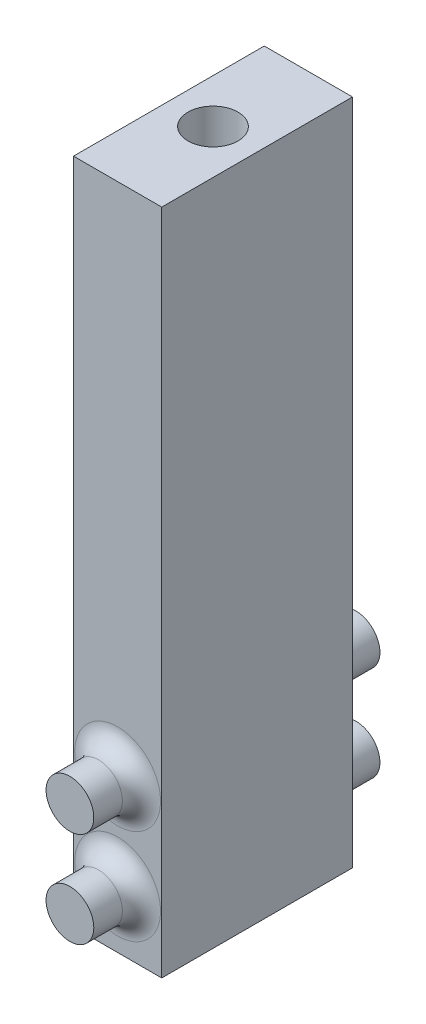
ISO-10303-21;
HEADER;
FILE_DESCRIPTION(('STEP AP214'),'2;1');
FILE_NAME('part.step','',(''),(''),'','','');
FILE_SCHEMA(('AUTOMOTIVE_DESIGN { 1 0 10303 214 1 1 1 1 }'));
ENDSEC;
DATA;
#1=APPLICATION_CONTEXT('core data for automotive mechanical design processes');
#2=APPLICATION_PROTOCOL_DEFINITION('international standard','automotive_design',2000,#1);
#3=PRODUCT_CONTEXT('',#1,'mechanical');
#4=PRODUCT('Part','Part','',(#3));
#5=PRODUCT_RELATED_PRODUCT_CATEGORY('part','',(#4));
#6=PRODUCT_DEFINITION_FORMATION('','',#4);
#7=PRODUCT_DEFINITION_CONTEXT('part definition',#1,'design');
#8=PRODUCT_DEFINITION('design','',#6,#7);
#9=PRODUCT_DEFINITION_SHAPE('','',#8);
#10=(LENGTH_UNIT() NAMED_UNIT(*) SI_UNIT(.MILLI.,.METRE.));
#11=(NAMED_UNIT(*) PLANE_ANGLE_UNIT() SI_UNIT($,.RADIAN.));
#12=(NAMED_UNIT(*) SI_UNIT($,.STERADIAN.) SOLID_ANGLE_UNIT());
#13=UNCERTAINTY_MEASURE_WITH_UNIT(LENGTH_MEASURE(1.E-05),#10,'distance_accuracy_value','');
#14=(GEOMETRIC_REPRESENTATION_CONTEXT(3) GLOBAL_UNCERTAINTY_ASSIGNED_CONTEXT((#13)) GLOBAL_UNIT_ASSIGNED_CONTEXT((#10,
#11,#12)) REPRESENTATION_CONTEXT('',''));
#15=CARTESIAN_POINT('',(0.,0.,0.));
#16=DIRECTION('',(0.,0.,1.));
#17=DIRECTION('',(1.,0.,0.));
#18=AXIS2_PLACEMENT_3D('',#15,#16,#17);
#19=CARTESIAN_POINT('',(20.9221246361529,20.,38.3604722689117));
#20=DIRECTION('',(0.,-1.,0.));
#21=DIRECTION('',(0.,0.,-1.));
#22=AXIS2_PLACEMENT_3D('',#19,#20,#21);
#23=CYLINDRICAL_SURFACE('',#22,5.5);
#24=DIRECTION('',(0.,-1.,0.));
#25=VECTOR('',#24,1.);
#26=CARTESIAN_POINT('',(25.940839611124,20.,40.6104722689117));
#27=LINE('',#26,#25);
#28=CARTESIAN_POINT('',(25.940839611124,16.,40.6104722689117));
#29=VERTEX_POINT('',#28);
#30=CARTESIAN_POINT('',(25.940839611124,20.,40.6104722689117));
#31=VERTEX_POINT('',#30);
#32=EDGE_CURVE('E145',#29,#31,#27,.F.);
#33=ORIENTED_EDGE('',*,*,#32,.F.);
#34=CARTESIAN_POINT('',(20.9221246361529,16.,38.3604722689117));
#35=DIRECTION('',(0.,1.,0.));
#36=DIRECTION('',(0.,0.,1.));
#37=AXIS2_PLACEMENT_3D('',#34,#35,#36);
#38=CIRCLE('',#37,5.5);
#39=CARTESIAN_POINT('',(25.940839611124,16.,36.1104722689117));
#40=VERTEX_POINT('',#39);
#41=EDGE_CURVE('E257',#40,#29,#38,.F.);
#42=ORIENTED_EDGE('',*,*,#41,.F.);
#43=DIRECTION('',(0.,-1.,0.));
#44=VECTOR('',#43,1.);
#45=CARTESIAN_POINT('',(25.940839611124,20.,36.1104722689117));
#46=LINE('',#45,#44);
#47=CARTESIAN_POINT('',(25.940839611124,20.,36.1104722689117));
#48=VERTEX_POINT('',#47);
#49=EDGE_CURVE('E259',#48,#40,#46,.T.);
#50=ORIENTED_EDGE('',*,*,#49,.F.);
#51=CARTESIAN_POINT('',(20.9221246361529,20.,38.3604722689117));
#52=DIRECTION('',(0.,-1.,0.));
#53=DIRECTION('',(0.,0.,-1.));
#54=AXIS2_PLACEMENT_3D('',#51,#52,#53);
#55=CIRCLE('',#54,5.5);
#56=CARTESIAN_POINT('',(25.8211041217192,20.,35.8604722689117));
#57=VERTEX_POINT('',#56);
#58=EDGE_CURVE('E207',#57,#48,#55,.T.);
#59=ORIENTED_EDGE('',*,*,#58,.F.);
#60=CARTESIAN_POINT('',(23.6721246361528,20.,33.5973325480973));
#61=VERTEX_POINT('',#60);
#62=EDGE_CURVE('E203',#61,#57,#55,.T.);
#63=ORIENTED_EDGE('',*,*,#62,.F.);
#64=DIRECTION('',(0.,-1.,0.));
#65=VECTOR('',#64,1.);
#66=CARTESIAN_POINT('',(23.6721246361528,20.,33.5973325480973));
#67=LINE('',#66,#65);
#68=CARTESIAN_POINT('',(23.6721246361528,0.,33.5973325480973));
#69=VERTEX_POINT('',#68);
#70=EDGE_CURVE('E206',#69,#61,#67,.F.);
#71=ORIENTED_EDGE('',*,*,#70,.F.);
#72=CARTESIAN_POINT('',(20.9221246361529,0.,38.3604722689117));
#73=DIRECTION('',(0.,-1.,0.));
#74=DIRECTION('',(0.,0.,-1.));
#75=AXIS2_PLACEMENT_3D('',#72,#73,#74);
#76=CIRCLE('',#75,5.5);
#77=CARTESIAN_POINT('',(23.6721246361528,0.,43.1236119897261));
#78=VERTEX_POINT('',#77);
#79=EDGE_CURVE('E196',#69,#78,#76,.T.);
#80=ORIENTED_EDGE('',*,*,#79,.T.);
#81=DIRECTION('',(0.,-1.,0.));
#82=VECTOR('',#81,1.);
#83=CARTESIAN_POINT('',(23.6721246361528,20.,43.1236119897261));
#84=LINE('',#83,#82);
#85=CARTESIAN_POINT('',(23.6721246361528,20.,43.1236119897261));
#86=VERTEX_POINT('',#85);
#87=EDGE_CURVE('E213',#86,#78,#84,.T.);
#88=ORIENTED_EDGE('',*,*,#87,.F.);
#89=CARTESIAN_POINT('',(25.8211041217192,20.,40.8604722689117));
#90=VERTEX_POINT('',#89);
#91=EDGE_CURVE('E210',#90,#86,#55,.T.);
#92=ORIENTED_EDGE('',*,*,#91,.F.);
#93=EDGE_CURVE('E208',#31,#90,#55,.T.);
#94=ORIENTED_EDGE('',*,*,#93,.F.);
#95=EDGE_LOOP('',(#33,#42,#50,#59,#63,#71,#80,#88,#92,#94));
#96=FACE_BOUND('',#95,.T.);
#97=ADVANCED_FACE('F35',(#96),#23,.F.);
#98=CARTESIAN_POINT('',(20.9221246361529,20.,38.3604722689117));
#99=DIRECTION('',(0.,-1.,0.));
#100=DIRECTION('',(0.,0.,-1.));
#101=AXIS2_PLACEMENT_3D('',#98,#99,#100);
#102=PLANE('',#101);
#103=DIRECTION('',(-1.,0.,0.));
#104=VECTOR('',#103,1.);
#105=CARTESIAN_POINT('',(23.6721246361528,20.,40.8604722689117));
#106=LINE('',#105,#104);
#107=CARTESIAN_POINT('',(23.6721246361528,20.,40.8604722689117));
#108=VERTEX_POINT('',#107);
#109=EDGE_CURVE('E180',#90,#108,#106,.T.);
#110=ORIENTED_EDGE('',*,*,#109,.F.);
#111=ORIENTED_EDGE('',*,*,#91,.T.);
#112=DIRECTION('',(0.,0.,-1.));
#113=VECTOR('',#112,1.);
#114=CARTESIAN_POINT('',(23.6721246361528,20.,28.3604722689117));
#115=LINE('',#114,#113);
#116=EDGE_CURVE('E254',#86,#108,#115,.T.);
#117=ORIENTED_EDGE('',*,*,#116,.T.);
#118=EDGE_LOOP('',(#110,#111,#117));
#119=FACE_BOUND('',#118,.T.);
#120=ADVANCED_FACE('F308',(#119),#102,.T.);
#121=DIRECTION('',(1.,0.,0.));
#122=VECTOR('',#121,1.);
#123=CARTESIAN_POINT('',(23.6721246361528,20.,40.6104722689117));
#124=LINE('',#123,#122);
#125=CARTESIAN_POINT('',(30.4221246361528,20.,40.6104722689117));
#126=VERTEX_POINT('',#125);
#127=EDGE_CURVE('E137',#31,#126,#124,.T.);
#128=ORIENTED_EDGE('',*,*,#127,.F.);
#129=ORIENTED_EDGE('',*,*,#93,.T.);
#130=DIRECTION('',(0.,0.,1.));
#131=VECTOR('',#130,1.);
#132=CARTESIAN_POINT('',(25.8211041217192,20.,35.8604722689117));
#133=LINE('',#132,#131);
#134=EDGE_CURVE('E190',#57,#90,#133,.T.);
#135=ORIENTED_EDGE('',*,*,#134,.F.);
#136=ORIENTED_EDGE('',*,*,#58,.T.);
#137=DIRECTION('',(1.,0.,0.));
#138=VECTOR('',#137,1.);
#139=CARTESIAN_POINT('',(23.6721246361528,20.,36.1104722689117));
#140=LINE('',#139,#138);
#141=CARTESIAN_POINT('',(30.4221246361528,20.,36.1104722689117));
#142=VERTEX_POINT('',#141);
#143=EDGE_CURVE('E150',#48,#142,#140,.T.);
#144=ORIENTED_EDGE('',*,*,#143,.T.);
#145=DIRECTION('',(0.,0.,-1.));
#146=VECTOR('',#145,1.);
#147=CARTESIAN_POINT('',(30.4221246361528,20.,40.6104722689117));
#148=LINE('',#147,#146);
#149=EDGE_CURVE('E153',#126,#142,#148,.T.);
#150=ORIENTED_EDGE('',*,*,#149,.F.);
#151=EDGE_LOOP('',(#128,#129,#135,#136,#144,#150));
#152=FACE_BOUND('',#151,.T.);
#153=ADVANCED_FACE('F154',(#152),#102,.T.);
#154=CARTESIAN_POINT('',(23.6721246361528,70.,28.3604722689117));
#155=DIRECTION('',(1.,0.,0.));
#156=DIRECTION('',(0.,0.,-1.));
#157=AXIS2_PLACEMENT_3D('',#154,#155,#156);
#158=PLANE('',#157);
#159=DIRECTION('',(0.,0.,-1.));
#160=VECTOR('',#159,1.);
#161=CARTESIAN_POINT('',(23.6721246361528,27.,35.8604722689117));
#162=LINE('',#161,#160);
#163=CARTESIAN_POINT('',(23.6721246361528,27.,40.8604722689117));
#164=VERTEX_POINT('',#163);
#165=CARTESIAN_POINT('',(23.6721246361528,27.,35.8604722689117));
#166=VERTEX_POINT('',#165);
#167=EDGE_CURVE('E176',#164,#166,#162,.T.);
#168=ORIENTED_EDGE('',*,*,#167,.F.);
#169=DIRECTION('',(0.,-1.,0.));
#170=VECTOR('',#169,1.);
#171=CARTESIAN_POINT('',(23.6721246361528,27.,40.8604722689117));
#172=LINE('',#171,#170);
#173=EDGE_CURVE('E193',#164,#108,#172,.T.);
#174=ORIENTED_EDGE('',*,*,#173,.T.);
#175=ORIENTED_EDGE('',*,*,#116,.F.);
#176=ORIENTED_EDGE('',*,*,#87,.T.);
#177=DIRECTION('',(0.,0.,1.));
#178=VECTOR('',#177,1.);
#179=CARTESIAN_POINT('',(23.6721246361528,0.,28.3604722689117));
#180=LINE('',#179,#178);
#181=CARTESIAN_POINT('',(23.6721246361529,0.,48.3604722689117));
#182=VERTEX_POINT('',#181);
#183=EDGE_CURVE('E220',#78,#182,#180,.T.);
#184=ORIENTED_EDGE('',*,*,#183,.T.);
#185=DIRECTION('',(0.,-1.,0.));
#186=VECTOR('',#185,1.);
#187=CARTESIAN_POINT('',(23.6721246361529,70.,48.3604722689117));
#188=LINE('',#187,#186);
#189=CARTESIAN_POINT('',(23.6721246361529,70.,48.3604722689117));
#190=VERTEX_POINT('',#189);
#191=EDGE_CURVE('E250',#190,#182,#188,.T.);
#192=ORIENTED_EDGE('',*,*,#191,.F.);
#193=DIRECTION('',(0.,0.,1.));
#194=VECTOR('',#193,1.);
#195=CARTESIAN_POINT('',(23.6721246361528,70.,28.3604722689117));
#196=LINE('',#195,#194);
#197=CARTESIAN_POINT('',(23.6721246361528,70.,28.3604722689117));
#198=VERTEX_POINT('',#197);
#199=EDGE_CURVE('E223',#198,#190,#196,.T.);
#200=ORIENTED_EDGE('',*,*,#199,.F.);
#201=DIRECTION('',(0.,-1.,0.));
#202=VECTOR('',#201,1.);
#203=CARTESIAN_POINT('',(23.6721246361528,70.,28.3604722689117));
#204=LINE('',#203,#202);
#205=CARTESIAN_POINT('',(23.6721246361528,0.,28.3604722689117));
#206=VERTEX_POINT('',#205);
#207=EDGE_CURVE('E233',#198,#206,#204,.T.);
#208=ORIENTED_EDGE('',*,*,#207,.T.);
#209=EDGE_CURVE('E234',#206,#69,#180,.T.);
#210=ORIENTED_EDGE('',*,*,#209,.T.);
#211=ORIENTED_EDGE('',*,*,#70,.T.);
#212=CARTESIAN_POINT('',(23.6721246361528,20.,35.8604722689117));
#213=VERTEX_POINT('',#212);
#214=EDGE_CURVE('E253',#213,#61,#115,.T.);
#215=ORIENTED_EDGE('',*,*,#214,.F.);
#216=DIRECTION('',(0.,-1.,0.));
#217=VECTOR('',#216,1.);
#218=CARTESIAN_POINT('',(23.6721246361528,27.,35.8604722689117));
#219=LINE('',#218,#217);
#220=EDGE_CURVE('E58',#166,#213,#219,.T.);
#221=ORIENTED_EDGE('',*,*,#220,.F.);
#222=EDGE_LOOP('',(#168,#174,#175,#176,#184,#192,#200,#208,#210,#211,#215,#221));
#223=FACE_BOUND('',#222,.T.);
#224=ADVANCED_FACE('F345',(#223),#158,.F.);
#225=CARTESIAN_POINT('',(23.6721246361529,70.,48.3604722689117));
#226=DIRECTION('',(0.,0.,-1.));
#227=DIRECTION('',(-1.,0.,0.));
#228=AXIS2_PLACEMENT_3D('',#225,#226,#227);
#229=PLANE('',#228);
#230=CARTESIAN_POINT('',(28.2971246361529,6.,48.3604722689117));
#231=DIRECTION('',(0.,0.,-1.));
#232=DIRECTION('',(-1.,0.,0.));
#233=AXIS2_PLACEMENT_3D('',#230,#231,#232);
#234=CIRCLE('',#233,4.5);
#235=CARTESIAN_POINT('',(23.7971246361529,6.,48.3604722689117));
#236=VERTEX_POINT('',#235);
#237=EDGE_CURVE('E43',#236,#236,#234,.T.);
#238=ORIENTED_EDGE('',*,*,#237,.T.);
#239=EDGE_LOOP('',(#238));
#240=FACE_BOUND('',#239,.T.);
#241=CARTESIAN_POINT('',(28.2971246361529,16.,48.3604722689117));
#242=DIRECTION('',(0.,0.,-1.));
#243=DIRECTION('',(-1.,0.,0.));
#244=AXIS2_PLACEMENT_3D('',#241,#242,#243);
#245=CIRCLE('',#244,4.5);
#246=CARTESIAN_POINT('',(23.7971246361529,16.,48.3604722689117));
#247=VERTEX_POINT('',#246);
#248=EDGE_CURVE('E277',#247,#247,#245,.T.);
#249=ORIENTED_EDGE('',*,*,#248,.T.);
#250=EDGE_LOOP('',(#249));
#251=FACE_BOUND('',#250,.T.);
#252=DIRECTION('',(1.,0.,0.));
#253=VECTOR('',#252,1.);
#254=CARTESIAN_POINT('',(23.6721246361529,0.,48.3604722689117));
#255=LINE('',#254,#253);
#256=CARTESIAN_POINT('',(32.9221246361529,0.,48.3604722689117));
#257=VERTEX_POINT('',#256);
#258=EDGE_CURVE('E237',#182,#257,#255,.T.);
#259=ORIENTED_EDGE('',*,*,#258,.T.);
#260=DIRECTION('',(0.,-1.,0.));
#261=VECTOR('',#260,1.);
#262=CARTESIAN_POINT('',(32.9221246361529,70.,48.3604722689117));
#263=LINE('',#262,#261);
#264=CARTESIAN_POINT('',(32.9221246361529,70.,48.3604722689117));
#265=VERTEX_POINT('',#264);
#266=EDGE_CURVE('E247',#265,#257,#263,.T.);
#267=ORIENTED_EDGE('',*,*,#266,.F.);
#268=DIRECTION('',(1.,0.,0.));
#269=VECTOR('',#268,1.);
#270=CARTESIAN_POINT('',(23.6721246361529,70.,48.3604722689117));
#271=LINE('',#270,#269);
#272=EDGE_CURVE('E226',#190,#265,#271,.T.);
#273=ORIENTED_EDGE('',*,*,#272,.F.);
#274=ORIENTED_EDGE('',*,*,#191,.T.);
#275=EDGE_LOOP('',(#259,#267,#273,#274));
#276=FACE_BOUND('',#275,.T.);
#277=ADVANCED_FACE('F282',(#240,#251,#276),#229,.F.);
#278=CARTESIAN_POINT('',(32.9221246361529,70.,28.3604722689117));
#279=DIRECTION('',(-1.,0.,0.));
#280=DIRECTION('',(0.,0.,1.));
#281=AXIS2_PLACEMENT_3D('',#278,#279,#280);
#282=PLANE('',#281);
#283=DIRECTION('',(0.,0.,-1.));
#284=VECTOR('',#283,1.);
#285=CARTESIAN_POINT('',(32.9221246361529,0.,28.3604722689117));
#286=LINE('',#285,#284);
#287=CARTESIAN_POINT('',(32.9221246361529,0.,28.3604722689117));
#288=VERTEX_POINT('',#287);
#289=EDGE_CURVE('E239',#257,#288,#286,.T.);
#290=ORIENTED_EDGE('',*,*,#289,.T.);
#291=DIRECTION('',(0.,-1.,0.));
#292=VECTOR('',#291,1.);
#293=CARTESIAN_POINT('',(32.9221246361529,70.,28.3604722689117));
#294=LINE('',#293,#292);
#295=CARTESIAN_POINT('',(32.9221246361529,70.,28.3604722689117));
#296=VERTEX_POINT('',#295);
#297=EDGE_CURVE('E244',#296,#288,#294,.T.);
#298=ORIENTED_EDGE('',*,*,#297,.F.);
#299=DIRECTION('',(0.,0.,-1.));
#300=VECTOR('',#299,1.);
#301=CARTESIAN_POINT('',(32.9221246361529,70.,28.3604722689117));
#302=LINE('',#301,#300);
#303=EDGE_CURVE('E229',#265,#296,#302,.T.);
#304=ORIENTED_EDGE('',*,*,#303,.F.);
#305=ORIENTED_EDGE('',*,*,#266,.T.);
#306=EDGE_LOOP('',(#290,#298,#304,#305));
#307=FACE_BOUND('',#306,.T.);
#308=ADVANCED_FACE('F338',(#307),#282,.F.);
#309=CARTESIAN_POINT('',(23.6721246361528,70.,28.3604722689117));
#310=DIRECTION('',(0.,0.,1.));
#311=DIRECTION('',(1.,0.,0.));
#312=AXIS2_PLACEMENT_3D('',#309,#310,#311);
#313=PLANE('',#312);
#314=CARTESIAN_POINT('',(28.2971246361529,16.,28.3604722689117));
#315=DIRECTION('',(0.,0.,1.));
#316=DIRECTION('',(1.,0.,0.));
#317=AXIS2_PLACEMENT_3D('',#314,#315,#316);
#318=CIRCLE('',#317,4.5);
#319=CARTESIAN_POINT('',(32.7971246361529,16.,28.3604722689117));
#320=VERTEX_POINT('',#319);
#321=EDGE_CURVE('E265',#320,#320,#318,.T.);
#322=ORIENTED_EDGE('',*,*,#321,.T.);
#323=EDGE_LOOP('',(#322));
#324=FACE_BOUND('',#323,.T.);
#325=CARTESIAN_POINT('',(28.2971246361529,6.,28.3604722689117));
#326=DIRECTION('',(0.,0.,1.));
#327=DIRECTION('',(1.,0.,0.));
#328=AXIS2_PLACEMENT_3D('',#325,#326,#327);
#329=CIRCLE('',#328,4.5);
#330=CARTESIAN_POINT('',(32.7971246361529,6.,28.3604722689117));
#331=VERTEX_POINT('',#330);
#332=EDGE_CURVE('E262',#331,#331,#329,.T.);
#333=ORIENTED_EDGE('',*,*,#332,.T.);
#334=EDGE_LOOP('',(#333));
#335=FACE_BOUND('',#334,.T.);
#336=DIRECTION('',(-1.,0.,0.));
#337=VECTOR('',#336,1.);
#338=CARTESIAN_POINT('',(23.6721246361528,0.,28.3604722689117));
#339=LINE('',#338,#337);
#340=EDGE_CURVE('E227',#288,#206,#339,.T.);
#341=ORIENTED_EDGE('',*,*,#340,.T.);
#342=ORIENTED_EDGE('',*,*,#207,.F.);
#343=DIRECTION('',(-1.,0.,0.));
#344=VECTOR('',#343,1.);
#345=CARTESIAN_POINT('',(23.6721246361528,70.,28.3604722689117));
#346=LINE('',#345,#344);
#347=EDGE_CURVE('E231',#296,#198,#346,.T.);
#348=ORIENTED_EDGE('',*,*,#347,.F.);
#349=ORIENTED_EDGE('',*,*,#297,.T.);
#350=EDGE_LOOP('',(#341,#342,#348,#349));
#351=FACE_BOUND('',#350,.T.);
#352=ADVANCED_FACE('F331',(#324,#335,#351),#313,.F.);
#353=CARTESIAN_POINT('',(0.,70.,0.));
#354=DIRECTION('',(0.,1.,0.));
#355=DIRECTION('',(0.,0.,1.));
#356=AXIS2_PLACEMENT_3D('',#353,#354,#355);
#357=PLANE('',#356);
#358=CARTESIAN_POINT('',(28.2971246361529,70.,38.3604722689117));
#359=DIRECTION('',(0.,1.,0.));
#360=DIRECTION('',(0.,0.,1.));
#361=AXIS2_PLACEMENT_3D('',#358,#359,#360);
#362=CIRCLE('',#361,2.625);
#363=CARTESIAN_POINT('',(28.2971246361529,70.,40.9854722689117));
#364=VERTEX_POINT('',#363);
#365=EDGE_CURVE('E216',#364,#364,#362,.T.);
#366=ORIENTED_EDGE('',*,*,#365,.F.);
#367=EDGE_LOOP('',(#366));
#368=FACE_BOUND('',#367,.T.);
#369=ORIENTED_EDGE('',*,*,#199,.T.);
#370=ORIENTED_EDGE('',*,*,#272,.T.);
#371=ORIENTED_EDGE('',*,*,#303,.T.);
#372=ORIENTED_EDGE('',*,*,#347,.T.);
#373=EDGE_LOOP('',(#369,#370,#371,#372));
#374=FACE_BOUND('',#373,.T.);
#375=ADVANCED_FACE('F328',(#368,#374),#357,.T.);
#376=CARTESIAN_POINT('',(0.,0.,0.));
#377=DIRECTION('',(0.,1.,0.));
#378=DIRECTION('',(0.,0.,1.));
#379=AXIS2_PLACEMENT_3D('',#376,#377,#378);
#380=PLANE('',#379);
#381=ORIENTED_EDGE('',*,*,#183,.F.);
#382=ORIENTED_EDGE('',*,*,#79,.F.);
#383=ORIENTED_EDGE('',*,*,#209,.F.);
#384=ORIENTED_EDGE('',*,*,#340,.F.);
#385=ORIENTED_EDGE('',*,*,#289,.F.);
#386=ORIENTED_EDGE('',*,*,#258,.F.);
#387=EDGE_LOOP('',(#381,#382,#383,#384,#385,#386));
#388=FACE_BOUND('',#387,.T.);
#389=ADVANCED_FACE('F326',(#388),#380,.F.);
#390=CARTESIAN_POINT('',(28.2971246361529,48.,38.3604722689117));
#391=DIRECTION('',(0.,1.,0.));
#392=DIRECTION('',(0.,0.,1.));
#393=AXIS2_PLACEMENT_3D('',#390,#391,#392);
#394=CYLINDRICAL_SURFACE('',#393,2.625);
#395=CARTESIAN_POINT('',(28.2971246361529,48.,38.3604722689117));
#396=DIRECTION('',(0.,1.,0.));
#397=DIRECTION('',(0.,0.,1.));
#398=AXIS2_PLACEMENT_3D('',#395,#396,#397);
#399=CIRCLE('',#398,2.625);
#400=CARTESIAN_POINT('',(28.2971246361529,48.,40.9854722689117));
#401=VERTEX_POINT('',#400);
#402=EDGE_CURVE('E217',#401,#401,#399,.T.);
#403=ORIENTED_EDGE('',*,*,#402,.F.);
#404=EDGE_LOOP('',(#403));
#405=FACE_BOUND('',#404,.T.);
#406=ORIENTED_EDGE('',*,*,#365,.T.);
#407=EDGE_LOOP('',(#406));
#408=FACE_BOUND('',#407,.T.);
#409=ADVANCED_FACE('F322',(#405,#408),#394,.F.);
#410=CARTESIAN_POINT('',(28.2971246361529,48.,38.3604722689117));
#411=DIRECTION('',(0.,1.,0.));
#412=DIRECTION('',(0.,0.,1.));
#413=AXIS2_PLACEMENT_3D('',#410,#411,#412);
#414=PLANE('',#413);
#415=ORIENTED_EDGE('',*,*,#402,.T.);
#416=EDGE_LOOP('',(#415));
#417=FACE_BOUND('',#416,.T.);
#418=ADVANCED_FACE('F319',(#417),#414,.T.);
#419=DIRECTION('',(1.,0.,0.));
#420=VECTOR('',#419,1.);
#421=CARTESIAN_POINT('',(23.6721246361528,20.,35.8604722689117));
#422=LINE('',#421,#420);
#423=EDGE_CURVE('E149',#213,#57,#422,.T.);
#424=ORIENTED_EDGE('',*,*,#423,.F.);
#425=ORIENTED_EDGE('',*,*,#214,.T.);
#426=ORIENTED_EDGE('',*,*,#62,.T.);
#427=EDGE_LOOP('',(#424,#425,#426));
#428=FACE_BOUND('',#427,.T.);
#429=ADVANCED_FACE('F316',(#428),#102,.T.);
#430=CARTESIAN_POINT('',(23.6721246361528,27.,40.8604722689117));
#431=DIRECTION('',(0.,0.,1.));
#432=DIRECTION('',(1.,0.,0.));
#433=AXIS2_PLACEMENT_3D('',#430,#431,#432);
#434=PLANE('',#433);
#435=ORIENTED_EDGE('',*,*,#109,.T.);
#436=ORIENTED_EDGE('',*,*,#173,.F.);
#437=DIRECTION('',(-1.,0.,0.));
#438=VECTOR('',#437,1.);
#439=CARTESIAN_POINT('',(23.6721246361528,27.,40.8604722689117));
#440=LINE('',#439,#438);
#441=CARTESIAN_POINT('',(25.8211041217192,27.,40.8604722689117));
#442=VERTEX_POINT('',#441);
#443=EDGE_CURVE('E186',#442,#164,#440,.T.);
#444=ORIENTED_EDGE('',*,*,#443,.F.);
#445=DIRECTION('',(0.,-1.,0.));
#446=VECTOR('',#445,1.);
#447=CARTESIAN_POINT('',(25.8211041217192,27.,40.8604722689117));
#448=LINE('',#447,#446);
#449=EDGE_CURVE('E197',#442,#90,#448,.T.);
#450=ORIENTED_EDGE('',*,*,#449,.T.);
#451=EDGE_LOOP('',(#435,#436,#444,#450));
#452=FACE_BOUND('',#451,.T.);
#453=ADVANCED_FACE('F391',(#452),#434,.F.);
#454=CARTESIAN_POINT('',(25.8211041217192,27.,35.8604722689117));
#455=DIRECTION('',(1.,0.,0.));
#456=DIRECTION('',(0.,0.,-1.));
#457=AXIS2_PLACEMENT_3D('',#454,#455,#456);
#458=PLANE('',#457);
#459=ORIENTED_EDGE('',*,*,#134,.T.);
#460=ORIENTED_EDGE('',*,*,#449,.F.);
#461=DIRECTION('',(0.,0.,1.));
#462=VECTOR('',#461,1.);
#463=CARTESIAN_POINT('',(25.8211041217192,27.,35.8604722689117));
#464=LINE('',#463,#462);
#465=CARTESIAN_POINT('',(25.8211041217192,27.,35.8604722689117));
#466=VERTEX_POINT('',#465);
#467=EDGE_CURVE('E183',#466,#442,#464,.T.);
#468=ORIENTED_EDGE('',*,*,#467,.F.);
#469=DIRECTION('',(0.,-1.,0.));
#470=VECTOR('',#469,1.);
#471=CARTESIAN_POINT('',(25.8211041217192,27.,35.8604722689117));
#472=LINE('',#471,#470);
#473=EDGE_CURVE('E200',#466,#57,#472,.T.);
#474=ORIENTED_EDGE('',*,*,#473,.T.);
#475=EDGE_LOOP('',(#459,#460,#468,#474));
#476=FACE_BOUND('',#475,.T.);
#477=ADVANCED_FACE('F393',(#476),#458,.F.);
#478=CARTESIAN_POINT('',(23.6721246361528,27.,35.8604722689117));
#479=DIRECTION('',(0.,0.,-1.));
#480=DIRECTION('',(-1.,0.,0.));
#481=AXIS2_PLACEMENT_3D('',#478,#479,#480);
#482=PLANE('',#481);
#483=ORIENTED_EDGE('',*,*,#423,.T.);
#484=ORIENTED_EDGE('',*,*,#473,.F.);
#485=DIRECTION('',(1.,0.,0.));
#486=VECTOR('',#485,1.);
#487=CARTESIAN_POINT('',(23.6721246361528,27.,35.8604722689117));
#488=LINE('',#487,#486);
#489=EDGE_CURVE('E179',#166,#466,#488,.T.);
#490=ORIENTED_EDGE('',*,*,#489,.F.);
#491=ORIENTED_EDGE('',*,*,#220,.T.);
#492=EDGE_LOOP('',(#483,#484,#490,#491));
#493=FACE_BOUND('',#492,.T.);
#494=ADVANCED_FACE('F410',(#493),#482,.F.);
#495=CARTESIAN_POINT('',(0.,27.,0.));
#496=DIRECTION('',(0.,1.,0.));
#497=DIRECTION('',(0.,0.,1.));
#498=AXIS2_PLACEMENT_3D('',#495,#496,#497);
#499=PLANE('',#498);
#500=ORIENTED_EDGE('',*,*,#167,.T.);
#501=ORIENTED_EDGE('',*,*,#489,.T.);
#502=ORIENTED_EDGE('',*,*,#467,.T.);
#503=ORIENTED_EDGE('',*,*,#443,.T.);
#504=EDGE_LOOP('',(#500,#501,#502,#503));
#505=FACE_BOUND('',#504,.T.);
#506=ADVANCED_FACE('F387',(#505),#499,.F.);
#507=CARTESIAN_POINT('',(23.6721246361528,20.,40.6104722689117));
#508=DIRECTION('',(0.,0.,-1.));
#509=DIRECTION('',(0.,1.,0.));
#510=AXIS2_PLACEMENT_3D('',#507,#508,#509);
#511=PLANE('',#510);
#512=ORIENTED_EDGE('',*,*,#32,.T.);
#513=ORIENTED_EDGE('',*,*,#127,.T.);
#514=DIRECTION('',(0.,1.,0.));
#515=VECTOR('',#514,1.);
#516=CARTESIAN_POINT('',(30.4221246361528,20.,40.6104722689117));
#517=LINE('',#516,#515);
#518=CARTESIAN_POINT('',(30.4221246361528,16.,40.6104722689117));
#519=VERTEX_POINT('',#518);
#520=EDGE_CURVE('E142',#519,#126,#517,.T.);
#521=ORIENTED_EDGE('',*,*,#520,.F.);
#522=DIRECTION('',(1.,0.,0.));
#523=VECTOR('',#522,1.);
#524=CARTESIAN_POINT('',(23.6721246361528,16.,40.6104722689117));
#525=LINE('',#524,#523);
#526=EDGE_CURVE('E172',#29,#519,#525,.T.);
#527=ORIENTED_EDGE('',*,*,#526,.F.);
#528=EDGE_LOOP('',(#512,#513,#521,#527));
#529=FACE_BOUND('',#528,.T.);
#530=ADVANCED_FACE('F139',(#529),#511,.T.);
#531=CARTESIAN_POINT('',(23.6721246361528,20.,36.1104722689117));
#532=DIRECTION('',(0.,0.,1.));
#533=DIRECTION('',(0.,-1.,0.));
#534=AXIS2_PLACEMENT_3D('',#531,#532,#533);
#535=PLANE('',#534);
#536=ORIENTED_EDGE('',*,*,#49,.T.);
#537=DIRECTION('',(1.,0.,0.));
#538=VECTOR('',#537,1.);
#539=CARTESIAN_POINT('',(23.6721246361528,16.,36.1104722689117));
#540=LINE('',#539,#538);
#541=CARTESIAN_POINT('',(30.4221246361528,16.,36.1104722689117));
#542=VERTEX_POINT('',#541);
#543=EDGE_CURVE('E50',#40,#542,#540,.T.);
#544=ORIENTED_EDGE('',*,*,#543,.T.);
#545=DIRECTION('',(0.,-1.,0.));
#546=VECTOR('',#545,1.);
#547=CARTESIAN_POINT('',(30.4221246361528,20.,36.1104722689117));
#548=LINE('',#547,#546);
#549=EDGE_CURVE('E159',#142,#542,#548,.T.);
#550=ORIENTED_EDGE('',*,*,#549,.F.);
#551=ORIENTED_EDGE('',*,*,#143,.F.);
#552=EDGE_LOOP('',(#536,#544,#550,#551));
#553=FACE_BOUND('',#552,.T.);
#554=ADVANCED_FACE('F396',(#553),#535,.T.);
#555=CARTESIAN_POINT('',(23.6721246361528,16.,40.6104722689117));
#556=DIRECTION('',(0.,1.,0.));
#557=DIRECTION('',(0.,0.,1.));
#558=AXIS2_PLACEMENT_3D('',#555,#556,#557);
#559=PLANE('',#558);
#560=ORIENTED_EDGE('',*,*,#41,.T.);
#561=ORIENTED_EDGE('',*,*,#526,.T.);
#562=DIRECTION('',(0.,0.,1.));
#563=VECTOR('',#562,1.);
#564=CARTESIAN_POINT('',(30.4221246361528,16.,40.6104722689117));
#565=LINE('',#564,#563);
#566=EDGE_CURVE('E162',#542,#519,#565,.T.);
#567=ORIENTED_EDGE('',*,*,#566,.F.);
#568=ORIENTED_EDGE('',*,*,#543,.F.);
#569=EDGE_LOOP('',(#560,#561,#567,#568));
#570=FACE_BOUND('',#569,.T.);
#571=ADVANCED_FACE('F394',(#570),#559,.T.);
#572=CARTESIAN_POINT('',(30.4221246361528,0.,0.));
#573=DIRECTION('',(1.,0.,0.));
#574=DIRECTION('',(0.,0.,-1.));
#575=AXIS2_PLACEMENT_3D('',#572,#573,#574);
#576=PLANE('',#575);
#577=ORIENTED_EDGE('',*,*,#520,.T.);
#578=ORIENTED_EDGE('',*,*,#149,.T.);
#579=ORIENTED_EDGE('',*,*,#549,.T.);
#580=ORIENTED_EDGE('',*,*,#566,.T.);
#581=EDGE_LOOP('',(#577,#578,#579,#580));
#582=FACE_BOUND('',#581,.T.);
#583=ADVANCED_FACE('F161',(#582),#576,.F.);
#584=CARTESIAN_POINT('',(28.2971246361529,6.,53.3604722689117));
#585=DIRECTION('',(0.,0.,-1.));
#586=DIRECTION('',(-1.,0.,0.));
#587=AXIS2_PLACEMENT_3D('',#584,#585,#586);
#588=CYLINDRICAL_SURFACE('',#587,2.5);
#589=CARTESIAN_POINT('',(28.2971246361529,6.,50.3604722689117));
#590=DIRECTION('',(0.,0.,-1.));
#591=DIRECTION('',(-1.,0.,0.));
#592=AXIS2_PLACEMENT_3D('',#589,#590,#591);
#593=CIRCLE('',#592,2.5);
#594=CARTESIAN_POINT('',(25.7971246361529,6.,50.3604722689117));
#595=VERTEX_POINT('',#594);
#596=EDGE_CURVE('E274',#595,#595,#593,.F.);
#597=ORIENTED_EDGE('',*,*,#596,.T.);
#598=EDGE_LOOP('',(#597));
#599=FACE_BOUND('',#598,.T.);
#600=CARTESIAN_POINT('',(28.2971246361529,6.,53.3604722689117));
#601=DIRECTION('',(0.,0.,1.));
#602=DIRECTION('',(1.,0.,0.));
#603=AXIS2_PLACEMENT_3D('',#600,#601,#602);
#604=CIRCLE('',#603,2.5);
#605=CARTESIAN_POINT('',(30.7971246361529,6.,53.3604722689117));
#606=VERTEX_POINT('',#605);
#607=EDGE_CURVE('E163',#606,#606,#604,.T.);
#608=ORIENTED_EDGE('',*,*,#607,.F.);
#609=EDGE_LOOP('',(#608));
#610=FACE_BOUND('',#609,.T.);
#611=ADVANCED_FACE('F291',(#599,#610),#588,.T.);
#612=CARTESIAN_POINT('',(28.2971246361529,6.,53.3604722689117));
#613=DIRECTION('',(0.,0.,1.));
#614=DIRECTION('',(1.,0.,0.));
#615=AXIS2_PLACEMENT_3D('',#612,#613,#614);
#616=PLANE('',#615);
#617=ORIENTED_EDGE('',*,*,#607,.T.);
#618=EDGE_LOOP('',(#617));
#619=FACE_BOUND('',#618,.T.);
#620=ADVANCED_FACE('F294',(#619),#616,.T.);
#621=CARTESIAN_POINT('',(28.2971246361529,16.,53.3604722689117));
#622=DIRECTION('',(0.,0.,-1.));
#623=DIRECTION('',(-1.,0.,0.));
#624=AXIS2_PLACEMENT_3D('',#621,#622,#623);
#625=CYLINDRICAL_SURFACE('',#624,2.5);
#626=CARTESIAN_POINT('',(28.2971246361529,16.,50.3604722689117));
#627=DIRECTION('',(0.,0.,-1.));
#628=DIRECTION('',(-1.,0.,0.));
#629=AXIS2_PLACEMENT_3D('',#626,#627,#628);
#630=CIRCLE('',#629,2.5);
#631=CARTESIAN_POINT('',(25.7971246361529,16.,50.3604722689117));
#632=VERTEX_POINT('',#631);
#633=EDGE_CURVE('E11',#632,#632,#630,.F.);
#634=ORIENTED_EDGE('',*,*,#633,.T.);
#635=EDGE_LOOP('',(#634));
#636=FACE_BOUND('',#635,.T.);
#637=CARTESIAN_POINT('',(28.2971246361529,16.,53.3604722689117));
#638=DIRECTION('',(0.,0.,1.));
#639=DIRECTION('',(-1.,0.,0.));
#640=AXIS2_PLACEMENT_3D('',#637,#638,#639);
#641=CIRCLE('',#640,2.5);
#642=CARTESIAN_POINT('',(25.7971246361529,16.,53.3604722689117));
#643=VERTEX_POINT('',#642);
#644=EDGE_CURVE('E166',#643,#643,#641,.T.);
#645=ORIENTED_EDGE('',*,*,#644,.F.);
#646=EDGE_LOOP('',(#645));
#647=FACE_BOUND('',#646,.T.);
#648=ADVANCED_FACE('F299',(#636,#647),#625,.T.);
#649=CARTESIAN_POINT('',(28.2971246361529,16.,53.3604722689117));
#650=DIRECTION('',(0.,0.,-1.));
#651=DIRECTION('',(-1.,0.,0.));
#652=AXIS2_PLACEMENT_3D('',#649,#650,#651);
#653=PLANE('',#652);
#654=ORIENTED_EDGE('',*,*,#644,.T.);
#655=EDGE_LOOP('',(#654));
#656=FACE_BOUND('',#655,.T.);
#657=ADVANCED_FACE('F304',(#656),#653,.F.);
#658=CARTESIAN_POINT('',(28.2971246361529,6.,23.3604722689117));
#659=DIRECTION('',(0.,0.,1.));
#660=DIRECTION('',(1.,0.,0.));
#661=AXIS2_PLACEMENT_3D('',#658,#659,#660);
#662=CYLINDRICAL_SURFACE('',#661,2.5);
#663=CARTESIAN_POINT('',(28.2971246361529,6.,26.3604722689117));
#664=DIRECTION('',(0.,0.,1.));
#665=DIRECTION('',(1.,0.,0.));
#666=AXIS2_PLACEMENT_3D('',#663,#664,#665);
#667=CIRCLE('',#666,2.5);
#668=CARTESIAN_POINT('',(30.7971246361529,6.,26.3604722689117));
#669=VERTEX_POINT('',#668);
#670=EDGE_CURVE('E271',#669,#669,#667,.F.);
#671=ORIENTED_EDGE('',*,*,#670,.T.);
#672=EDGE_LOOP('',(#671));
#673=FACE_BOUND('',#672,.T.);
#674=CARTESIAN_POINT('',(28.2971246361529,6.,23.3604722689117));
#675=DIRECTION('',(0.,0.,1.));
#676=DIRECTION('',(1.,0.,0.));
#677=AXIS2_PLACEMENT_3D('',#674,#675,#676);
#678=CIRCLE('',#677,2.5);
#679=CARTESIAN_POINT('',(30.7971246361529,6.,23.3604722689117));
#680=VERTEX_POINT('',#679);
#681=EDGE_CURVE('E555',#680,#680,#678,.T.);
#682=ORIENTED_EDGE('',*,*,#681,.T.);
#683=EDGE_LOOP('',(#682));
#684=FACE_BOUND('',#683,.T.);
#685=ADVANCED_FACE('F457',(#673,#684),#662,.T.);
#686=CARTESIAN_POINT('',(28.2971246361529,6.,23.3604722689117));
#687=DIRECTION('',(0.,0.,-1.));
#688=DIRECTION('',(1.,0.,0.));
#689=AXIS2_PLACEMENT_3D('',#686,#687,#688);
#690=PLANE('',#689);
#691=ORIENTED_EDGE('',*,*,#681,.F.);
#692=EDGE_LOOP('',(#691));
#693=FACE_BOUND('',#692,.T.);
#694=ADVANCED_FACE('F465',(#693),#690,.T.);
#695=CARTESIAN_POINT('',(28.2971246361529,16.,23.3604722689117));
#696=DIRECTION('',(0.,0.,1.));
#697=DIRECTION('',(1.,0.,0.));
#698=AXIS2_PLACEMENT_3D('',#695,#696,#697);
#699=CYLINDRICAL_SURFACE('',#698,2.5);
#700=CARTESIAN_POINT('',(28.2971246361529,16.,26.3604722689117));
#701=DIRECTION('',(0.,0.,1.));
#702=DIRECTION('',(1.,0.,0.));
#703=AXIS2_PLACEMENT_3D('',#700,#701,#702);
#704=CIRCLE('',#703,2.5);
#705=CARTESIAN_POINT('',(30.7971246361529,16.,26.3604722689117));
#706=VERTEX_POINT('',#705);
#707=EDGE_CURVE('E268',#706,#706,#704,.F.);
#708=ORIENTED_EDGE('',*,*,#707,.T.);
#709=EDGE_LOOP('',(#708));
#710=FACE_BOUND('',#709,.T.);
#711=CARTESIAN_POINT('',(28.2971246361529,16.,23.3604722689117));
#712=DIRECTION('',(0.,0.,1.));
#713=DIRECTION('',(-1.,0.,0.));
#714=AXIS2_PLACEMENT_3D('',#711,#712,#713);
#715=CIRCLE('',#714,2.5);
#716=CARTESIAN_POINT('',(25.7971246361529,16.,23.3604722689117));
#717=VERTEX_POINT('',#716);
#718=EDGE_CURVE('E557',#717,#717,#715,.T.);
#719=ORIENTED_EDGE('',*,*,#718,.T.);
#720=EDGE_LOOP('',(#719));
#721=FACE_BOUND('',#720,.T.);
#722=ADVANCED_FACE('F470',(#710,#721),#699,.T.);
#723=CARTESIAN_POINT('',(28.2971246361529,16.,23.3604722689117));
#724=DIRECTION('',(0.,0.,1.));
#725=DIRECTION('',(-1.,0.,0.));
#726=AXIS2_PLACEMENT_3D('',#723,#724,#725);
#727=PLANE('',#726);
#728=ORIENTED_EDGE('',*,*,#718,.F.);
#729=EDGE_LOOP('',(#728));
#730=FACE_BOUND('',#729,.T.);
#731=ADVANCED_FACE('F352',(#730),#727,.F.);
#732=CARTESIAN_POINT('',(28.2971246361529,16.,26.3604722689117));
#733=DIRECTION('',(0.,0.,1.));
#734=DIRECTION('',(1.,0.,0.));
#735=AXIS2_PLACEMENT_3D('',#732,#733,#734);
#736=TOROIDAL_SURFACE('',#735,4.5,2.);
#737=ORIENTED_EDGE('',*,*,#707,.F.);
#738=EDGE_LOOP('',(#737));
#739=FACE_BOUND('',#738,.T.);
#740=ORIENTED_EDGE('',*,*,#321,.F.);
#741=EDGE_LOOP('',(#740));
#742=FACE_BOUND('',#741,.T.);
#743=ADVANCED_FACE('F349',(#739,#742),#736,.F.);
#744=CARTESIAN_POINT('',(28.2971246361529,6.,26.3604722689117));
#745=DIRECTION('',(0.,0.,1.));
#746=DIRECTION('',(1.,0.,0.));
#747=AXIS2_PLACEMENT_3D('',#744,#745,#746);
#748=TOROIDAL_SURFACE('',#747,4.5,2.);
#749=ORIENTED_EDGE('',*,*,#670,.F.);
#750=EDGE_LOOP('',(#749));
#751=FACE_BOUND('',#750,.T.);
#752=ORIENTED_EDGE('',*,*,#332,.F.);
#753=EDGE_LOOP('',(#752));
#754=FACE_BOUND('',#753,.T.);
#755=ADVANCED_FACE('F288',(#751,#754),#748,.F.);
#756=CARTESIAN_POINT('',(28.2971246361529,6.,50.3604722689117));
#757=DIRECTION('',(0.,0.,-1.));
#758=DIRECTION('',(-1.,0.,0.));
#759=AXIS2_PLACEMENT_3D('',#756,#757,#758);
#760=TOROIDAL_SURFACE('',#759,4.5,2.);
#761=ORIENTED_EDGE('',*,*,#237,.F.);
#762=EDGE_LOOP('',(#761));
#763=FACE_BOUND('',#762,.T.);
#764=ORIENTED_EDGE('',*,*,#596,.F.);
#765=EDGE_LOOP('',(#764));
#766=FACE_BOUND('',#765,.T.);
#767=ADVANCED_FACE('F285',(#763,#766),#760,.F.);
#768=CARTESIAN_POINT('',(28.2971246361529,16.,50.3604722689117));
#769=DIRECTION('',(0.,0.,-1.));
#770=DIRECTION('',(-1.,0.,0.));
#771=AXIS2_PLACEMENT_3D('',#768,#769,#770);
#772=TOROIDAL_SURFACE('',#771,4.5,2.);
#773=ORIENTED_EDGE('',*,*,#248,.F.);
#774=EDGE_LOOP('',(#773));
#775=FACE_BOUND('',#774,.T.);
#776=ORIENTED_EDGE('',*,*,#633,.F.);
#777=EDGE_LOOP('',(#776));
#778=FACE_BOUND('',#777,.T.);
#779=ADVANCED_FACE('F37',(#775,#778),#772,.F.);
#780=CLOSED_SHELL('',(#97,#120,#153,#224,#277,#308,#352,#375,#389,#409,#418,#429,#453,#477,#494,
#506,#530,#554,#571,#583,#611,#620,#648,#657,#685,#694,#722,#731,#743,#755,#767,#779));
#781=MANIFOLD_SOLID_BREP('B2',#780);
#782=ADVANCED_BREP_SHAPE_REPRESENTATION('',(#18,#781),#14);
#783=SHAPE_DEFINITION_REPRESENTATION(#9,#782);
ENDSEC;
END-ISO-10303-21;
